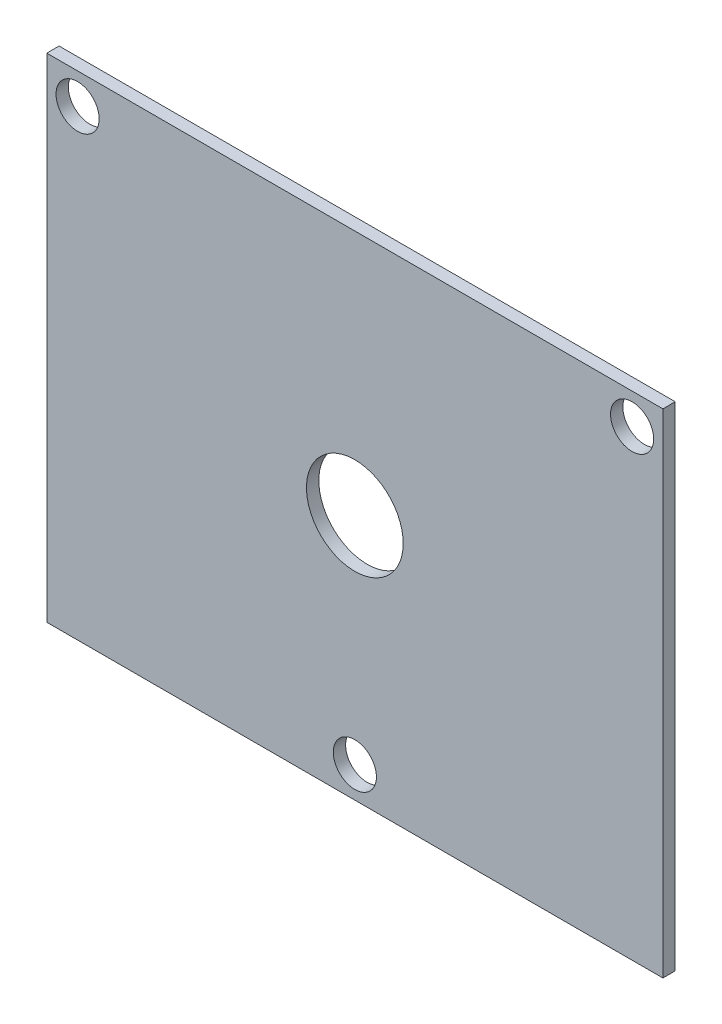
ISO-10303-21;
HEADER;
FILE_DESCRIPTION(('STEP AP214'),'2;1');
FILE_NAME('part.step','',(''),(''),'','','');
FILE_SCHEMA(('AUTOMOTIVE_DESIGN { 1 0 10303 214 1 1 1 1 }'));
ENDSEC;
DATA;
#1=APPLICATION_CONTEXT('core data for automotive mechanical design processes');
#2=APPLICATION_PROTOCOL_DEFINITION('international standard','automotive_design',2000,#1);
#3=PRODUCT_CONTEXT('',#1,'mechanical');
#4=PRODUCT('Part','Part','',(#3));
#5=PRODUCT_RELATED_PRODUCT_CATEGORY('part','',(#4));
#6=PRODUCT_DEFINITION_FORMATION('','',#4);
#7=PRODUCT_DEFINITION_CONTEXT('part definition',#1,'design');
#8=PRODUCT_DEFINITION('design','',#6,#7);
#9=PRODUCT_DEFINITION_SHAPE('','',#8);
#10=(LENGTH_UNIT() NAMED_UNIT(*) SI_UNIT(.MILLI.,.METRE.));
#11=(NAMED_UNIT(*) PLANE_ANGLE_UNIT() SI_UNIT($,.RADIAN.));
#12=(NAMED_UNIT(*) SI_UNIT($,.STERADIAN.) SOLID_ANGLE_UNIT());
#13=UNCERTAINTY_MEASURE_WITH_UNIT(LENGTH_MEASURE(1.E-05),#10,'distance_accuracy_value','');
#14=(GEOMETRIC_REPRESENTATION_CONTEXT(3) GLOBAL_UNCERTAINTY_ASSIGNED_CONTEXT((#13)) GLOBAL_UNIT_ASSIGNED_CONTEXT((#10,
#11,#12)) REPRESENTATION_CONTEXT('',''));
#15=CARTESIAN_POINT('',(0.,0.,0.));
#16=DIRECTION('',(0.,0.,1.));
#17=DIRECTION('',(1.,0.,0.));
#18=AXIS2_PLACEMENT_3D('',#15,#16,#17);
#19=CARTESIAN_POINT('',(0.,0.,5.08));
#20=DIRECTION('',(1.,0.,0.));
#21=DIRECTION('',(0.,0.,-1.));
#22=AXIS2_PLACEMENT_3D('',#19,#20,#21);
#23=PLANE('',#22);
#24=DIRECTION('',(0.,-1.,0.));
#25=VECTOR('',#24,1.);
#26=CARTESIAN_POINT('',(0.,0.,0.));
#27=LINE('',#26,#25);
#28=CARTESIAN_POINT('',(0.,203.2,0.));
#29=VERTEX_POINT('',#28);
#30=CARTESIAN_POINT('',(0.,0.,0.));
#31=VERTEX_POINT('',#30);
#32=EDGE_CURVE('E95',#29,#31,#27,.T.);
#33=ORIENTED_EDGE('',*,*,#32,.T.);
#34=DIRECTION('',(0.,0.,-1.));
#35=VECTOR('',#34,1.);
#36=CARTESIAN_POINT('',(0.,0.,5.08));
#37=LINE('',#36,#35);
#38=CARTESIAN_POINT('',(0.,0.,5.08));
#39=VERTEX_POINT('',#38);
#40=EDGE_CURVE('E11',#39,#31,#37,.T.);
#41=ORIENTED_EDGE('',*,*,#40,.F.);
#42=DIRECTION('',(0.,-1.,0.));
#43=VECTOR('',#42,1.);
#44=CARTESIAN_POINT('',(0.,0.,5.08));
#45=LINE('',#44,#43);
#46=CARTESIAN_POINT('',(0.,203.2,5.08));
#47=VERTEX_POINT('',#46);
#48=EDGE_CURVE('E83',#47,#39,#45,.T.);
#49=ORIENTED_EDGE('',*,*,#48,.F.);
#50=DIRECTION('',(0.,0.,-1.));
#51=VECTOR('',#50,1.);
#52=CARTESIAN_POINT('',(0.,203.2,5.08));
#53=LINE('',#52,#51);
#54=EDGE_CURVE('E91',#47,#29,#53,.T.);
#55=ORIENTED_EDGE('',*,*,#54,.T.);
#56=EDGE_LOOP('',(#33,#41,#49,#55));
#57=FACE_BOUND('',#56,.T.);
#58=ADVANCED_FACE('F32',(#57),#23,.F.);
#59=CARTESIAN_POINT('',(0.,0.,5.08));
#60=DIRECTION('',(0.,1.,0.));
#61=DIRECTION('',(0.,0.,1.));
#62=AXIS2_PLACEMENT_3D('',#59,#60,#61);
#63=PLANE('',#62);
#64=DIRECTION('',(1.,0.,0.));
#65=VECTOR('',#64,1.);
#66=CARTESIAN_POINT('',(0.,0.,0.));
#67=LINE('',#66,#65);
#68=CARTESIAN_POINT('',(254.,0.,0.));
#69=VERTEX_POINT('',#68);
#70=EDGE_CURVE('E87',#31,#69,#67,.T.);
#71=ORIENTED_EDGE('',*,*,#70,.T.);
#72=DIRECTION('',(0.,0.,-1.));
#73=VECTOR('',#72,1.);
#74=CARTESIAN_POINT('',(254.,0.,5.08));
#75=LINE('',#74,#73);
#76=CARTESIAN_POINT('',(254.,0.,5.08));
#77=VERTEX_POINT('',#76);
#78=EDGE_CURVE('E40',#77,#69,#75,.T.);
#79=ORIENTED_EDGE('',*,*,#78,.F.);
#80=DIRECTION('',(1.,0.,0.));
#81=VECTOR('',#80,1.);
#82=CARTESIAN_POINT('',(0.,0.,5.08));
#83=LINE('',#82,#81);
#84=EDGE_CURVE('E78',#39,#77,#83,.T.);
#85=ORIENTED_EDGE('',*,*,#84,.F.);
#86=ORIENTED_EDGE('',*,*,#40,.T.);
#87=EDGE_LOOP('',(#71,#79,#85,#86));
#88=FACE_BOUND('',#87,.T.);
#89=ADVANCED_FACE('F86',(#88),#63,.F.);
#90=CARTESIAN_POINT('',(254.,0.,5.08));
#91=DIRECTION('',(-1.,0.,0.));
#92=DIRECTION('',(0.,0.,1.));
#93=AXIS2_PLACEMENT_3D('',#90,#91,#92);
#94=PLANE('',#93);
#95=DIRECTION('',(0.,1.,0.));
#96=VECTOR('',#95,1.);
#97=CARTESIAN_POINT('',(254.,0.,0.));
#98=LINE('',#97,#96);
#99=CARTESIAN_POINT('',(254.,203.2,0.));
#100=VERTEX_POINT('',#99);
#101=EDGE_CURVE('E65',#69,#100,#98,.T.);
#102=ORIENTED_EDGE('',*,*,#101,.T.);
#103=DIRECTION('',(0.,0.,-1.));
#104=VECTOR('',#103,1.);
#105=CARTESIAN_POINT('',(254.,203.2,5.08));
#106=LINE('',#105,#104);
#107=CARTESIAN_POINT('',(254.,203.2,5.08));
#108=VERTEX_POINT('',#107);
#109=EDGE_CURVE('E88',#108,#100,#106,.T.);
#110=ORIENTED_EDGE('',*,*,#109,.F.);
#111=DIRECTION('',(0.,1.,0.));
#112=VECTOR('',#111,1.);
#113=CARTESIAN_POINT('',(254.,0.,5.08));
#114=LINE('',#113,#112);
#115=EDGE_CURVE('E81',#77,#108,#114,.T.);
#116=ORIENTED_EDGE('',*,*,#115,.F.);
#117=ORIENTED_EDGE('',*,*,#78,.T.);
#118=EDGE_LOOP('',(#102,#110,#116,#117));
#119=FACE_BOUND('',#118,.T.);
#120=ADVANCED_FACE('F89',(#119),#94,.F.);
#121=CARTESIAN_POINT('',(0.,203.2,5.08));
#122=DIRECTION('',(0.,-1.,0.));
#123=DIRECTION('',(0.,0.,-1.));
#124=AXIS2_PLACEMENT_3D('',#121,#122,#123);
#125=PLANE('',#124);
#126=DIRECTION('',(-1.,0.,0.));
#127=VECTOR('',#126,1.);
#128=CARTESIAN_POINT('',(0.,203.2,0.));
#129=LINE('',#128,#127);
#130=EDGE_CURVE('E71',#100,#29,#129,.T.);
#131=ORIENTED_EDGE('',*,*,#130,.T.);
#132=ORIENTED_EDGE('',*,*,#54,.F.);
#133=DIRECTION('',(-1.,0.,0.));
#134=VECTOR('',#133,1.);
#135=CARTESIAN_POINT('',(0.,203.2,5.08));
#136=LINE('',#135,#134);
#137=EDGE_CURVE('E48',#108,#47,#136,.T.);
#138=ORIENTED_EDGE('',*,*,#137,.F.);
#139=ORIENTED_EDGE('',*,*,#109,.T.);
#140=EDGE_LOOP('',(#131,#132,#138,#139));
#141=FACE_BOUND('',#140,.T.);
#142=ADVANCED_FACE('F103',(#141),#125,.F.);
#143=CARTESIAN_POINT('',(0.,0.,5.08));
#144=DIRECTION('',(0.,0.,-1.));
#145=DIRECTION('',(-1.,0.,0.));
#146=AXIS2_PLACEMENT_3D('',#143,#144,#145);
#147=PLANE('',#146);
#148=CARTESIAN_POINT('',(12.7,190.5,5.08));
#149=DIRECTION('',(0.,0.,1.));
#150=DIRECTION('',(1.,0.,0.));
#151=AXIS2_PLACEMENT_3D('',#148,#149,#150);
#152=CIRCLE('',#151,8.89);
#153=CARTESIAN_POINT('',(21.59,190.5,5.08));
#154=VERTEX_POINT('',#153);
#155=EDGE_CURVE('E127',#154,#154,#152,.T.);
#156=ORIENTED_EDGE('',*,*,#155,.F.);
#157=EDGE_LOOP('',(#156));
#158=FACE_BOUND('',#157,.T.);
#159=CARTESIAN_POINT('',(241.3,190.5,5.08));
#160=DIRECTION('',(0.,0.,1.));
#161=DIRECTION('',(1.,0.,0.));
#162=AXIS2_PLACEMENT_3D('',#159,#160,#161);
#163=CIRCLE('',#162,8.89000000000001);
#164=CARTESIAN_POINT('',(250.19,190.5,5.08));
#165=VERTEX_POINT('',#164);
#166=EDGE_CURVE('E121',#165,#165,#163,.T.);
#167=ORIENTED_EDGE('',*,*,#166,.F.);
#168=EDGE_LOOP('',(#167));
#169=FACE_BOUND('',#168,.T.);
#170=CARTESIAN_POINT('',(127.,12.7,5.08));
#171=DIRECTION('',(0.,0.,1.));
#172=DIRECTION('',(1.,0.,0.));
#173=AXIS2_PLACEMENT_3D('',#170,#171,#172);
#174=CIRCLE('',#173,8.89000000000001);
#175=CARTESIAN_POINT('',(135.89,12.7,5.08));
#176=VERTEX_POINT('',#175);
#177=EDGE_CURVE('E115',#176,#176,#174,.T.);
#178=ORIENTED_EDGE('',*,*,#177,.F.);
#179=EDGE_LOOP('',(#178));
#180=FACE_BOUND('',#179,.T.);
#181=CARTESIAN_POINT('',(127.,101.6,5.08));
#182=DIRECTION('',(0.,0.,1.));
#183=DIRECTION('',(1.,0.,0.));
#184=AXIS2_PLACEMENT_3D('',#181,#182,#183);
#185=CIRCLE('',#184,19.939);
#186=CARTESIAN_POINT('',(146.939,101.6,5.08));
#187=VERTEX_POINT('',#186);
#188=EDGE_CURVE('E109',#187,#187,#185,.T.);
#189=ORIENTED_EDGE('',*,*,#188,.F.);
#190=EDGE_LOOP('',(#189));
#191=FACE_BOUND('',#190,.T.);
#192=ORIENTED_EDGE('',*,*,#48,.T.);
#193=ORIENTED_EDGE('',*,*,#84,.T.);
#194=ORIENTED_EDGE('',*,*,#115,.T.);
#195=ORIENTED_EDGE('',*,*,#137,.T.);
#196=EDGE_LOOP('',(#192,#193,#194,#195));
#197=FACE_BOUND('',#196,.T.);
#198=ADVANCED_FACE('F79',(#158,#169,#180,#191,#197),#147,.F.);
#199=CARTESIAN_POINT('',(0.,0.,0.));
#200=DIRECTION('',(0.,0.,-1.));
#201=DIRECTION('',(-1.,0.,0.));
#202=AXIS2_PLACEMENT_3D('',#199,#200,#201);
#203=PLANE('',#202);
#204=CARTESIAN_POINT('',(12.7,190.5,0.));
#205=DIRECTION('',(0.,0.,1.));
#206=DIRECTION('',(1.,0.,0.));
#207=AXIS2_PLACEMENT_3D('',#204,#205,#206);
#208=CIRCLE('',#207,8.89);
#209=CARTESIAN_POINT('',(21.59,190.5,0.));
#210=VERTEX_POINT('',#209);
#211=EDGE_CURVE('E112',#210,#210,#208,.T.);
#212=ORIENTED_EDGE('',*,*,#211,.T.);
#213=EDGE_LOOP('',(#212));
#214=FACE_BOUND('',#213,.T.);
#215=CARTESIAN_POINT('',(241.3,190.5,0.));
#216=DIRECTION('',(0.,0.,1.));
#217=DIRECTION('',(1.,0.,0.));
#218=AXIS2_PLACEMENT_3D('',#215,#216,#217);
#219=CIRCLE('',#218,8.89000000000001);
#220=CARTESIAN_POINT('',(250.19,190.5,0.));
#221=VERTEX_POINT('',#220);
#222=EDGE_CURVE('E124',#221,#221,#219,.T.);
#223=ORIENTED_EDGE('',*,*,#222,.T.);
#224=EDGE_LOOP('',(#223));
#225=FACE_BOUND('',#224,.T.);
#226=CARTESIAN_POINT('',(127.,12.7,0.));
#227=DIRECTION('',(0.,0.,1.));
#228=DIRECTION('',(1.,0.,0.));
#229=AXIS2_PLACEMENT_3D('',#226,#227,#228);
#230=CIRCLE('',#229,8.89000000000001);
#231=CARTESIAN_POINT('',(135.89,12.7,0.));
#232=VERTEX_POINT('',#231);
#233=EDGE_CURVE('E118',#232,#232,#230,.T.);
#234=ORIENTED_EDGE('',*,*,#233,.T.);
#235=EDGE_LOOP('',(#234));
#236=FACE_BOUND('',#235,.T.);
#237=CARTESIAN_POINT('',(127.,101.6,0.));
#238=DIRECTION('',(0.,0.,1.));
#239=DIRECTION('',(1.,0.,0.));
#240=AXIS2_PLACEMENT_3D('',#237,#238,#239);
#241=CIRCLE('',#240,19.939);
#242=CARTESIAN_POINT('',(146.939,101.6,0.));
#243=VERTEX_POINT('',#242);
#244=EDGE_CURVE('E98',#243,#243,#241,.T.);
#245=ORIENTED_EDGE('',*,*,#244,.T.);
#246=EDGE_LOOP('',(#245));
#247=FACE_BOUND('',#246,.T.);
#248=ORIENTED_EDGE('',*,*,#32,.F.);
#249=ORIENTED_EDGE('',*,*,#130,.F.);
#250=ORIENTED_EDGE('',*,*,#101,.F.);
#251=ORIENTED_EDGE('',*,*,#70,.F.);
#252=EDGE_LOOP('',(#248,#249,#250,#251));
#253=FACE_BOUND('',#252,.T.);
#254=ADVANCED_FACE('F106',(#214,#225,#236,#247,#253),#203,.T.);
#255=CARTESIAN_POINT('',(127.,101.6,0.));
#256=DIRECTION('',(0.,0.,1.));
#257=DIRECTION('',(1.,0.,0.));
#258=AXIS2_PLACEMENT_3D('',#255,#256,#257);
#259=CYLINDRICAL_SURFACE('',#258,19.939);
#260=ORIENTED_EDGE('',*,*,#244,.F.);
#261=EDGE_LOOP('',(#260));
#262=FACE_BOUND('',#261,.T.);
#263=ORIENTED_EDGE('',*,*,#188,.T.);
#264=EDGE_LOOP('',(#263));
#265=FACE_BOUND('',#264,.T.);
#266=ADVANCED_FACE('F151',(#262,#265),#259,.F.);
#267=CARTESIAN_POINT('',(127.,12.7,0.));
#268=DIRECTION('',(0.,0.,1.));
#269=DIRECTION('',(1.,0.,0.));
#270=AXIS2_PLACEMENT_3D('',#267,#268,#269);
#271=CYLINDRICAL_SURFACE('',#270,8.89000000000001);
#272=ORIENTED_EDGE('',*,*,#233,.F.);
#273=EDGE_LOOP('',(#272));
#274=FACE_BOUND('',#273,.T.);
#275=ORIENTED_EDGE('',*,*,#177,.T.);
#276=EDGE_LOOP('',(#275));
#277=FACE_BOUND('',#276,.T.);
#278=ADVANCED_FACE('F153',(#274,#277),#271,.F.);
#279=CARTESIAN_POINT('',(241.3,190.5,0.));
#280=DIRECTION('',(0.,0.,1.));
#281=DIRECTION('',(1.,0.,0.));
#282=AXIS2_PLACEMENT_3D('',#279,#280,#281);
#283=CYLINDRICAL_SURFACE('',#282,8.89000000000001);
#284=ORIENTED_EDGE('',*,*,#222,.F.);
#285=EDGE_LOOP('',(#284));
#286=FACE_BOUND('',#285,.T.);
#287=ORIENTED_EDGE('',*,*,#166,.T.);
#288=EDGE_LOOP('',(#287));
#289=FACE_BOUND('',#288,.T.);
#290=ADVANCED_FACE('F138',(#286,#289),#283,.F.);
#291=CARTESIAN_POINT('',(12.7,190.5,0.));
#292=DIRECTION('',(0.,0.,1.));
#293=DIRECTION('',(1.,0.,0.));
#294=AXIS2_PLACEMENT_3D('',#291,#292,#293);
#295=CYLINDRICAL_SURFACE('',#294,8.89);
#296=ORIENTED_EDGE('',*,*,#211,.F.);
#297=EDGE_LOOP('',(#296));
#298=FACE_BOUND('',#297,.T.);
#299=ORIENTED_EDGE('',*,*,#155,.T.);
#300=EDGE_LOOP('',(#299));
#301=FACE_BOUND('',#300,.T.);
#302=ADVANCED_FACE('F135',(#298,#301),#295,.F.);
#303=CLOSED_SHELL('',(#58,#89,#120,#142,#198,#254,#266,#278,#290,#302));
#304=MANIFOLD_SOLID_BREP('B2',#303);
#305=ADVANCED_BREP_SHAPE_REPRESENTATION('',(#18,#304),#14);
#306=SHAPE_DEFINITION_REPRESENTATION(#9,#305);
ENDSEC;
END-ISO-10303-21;
